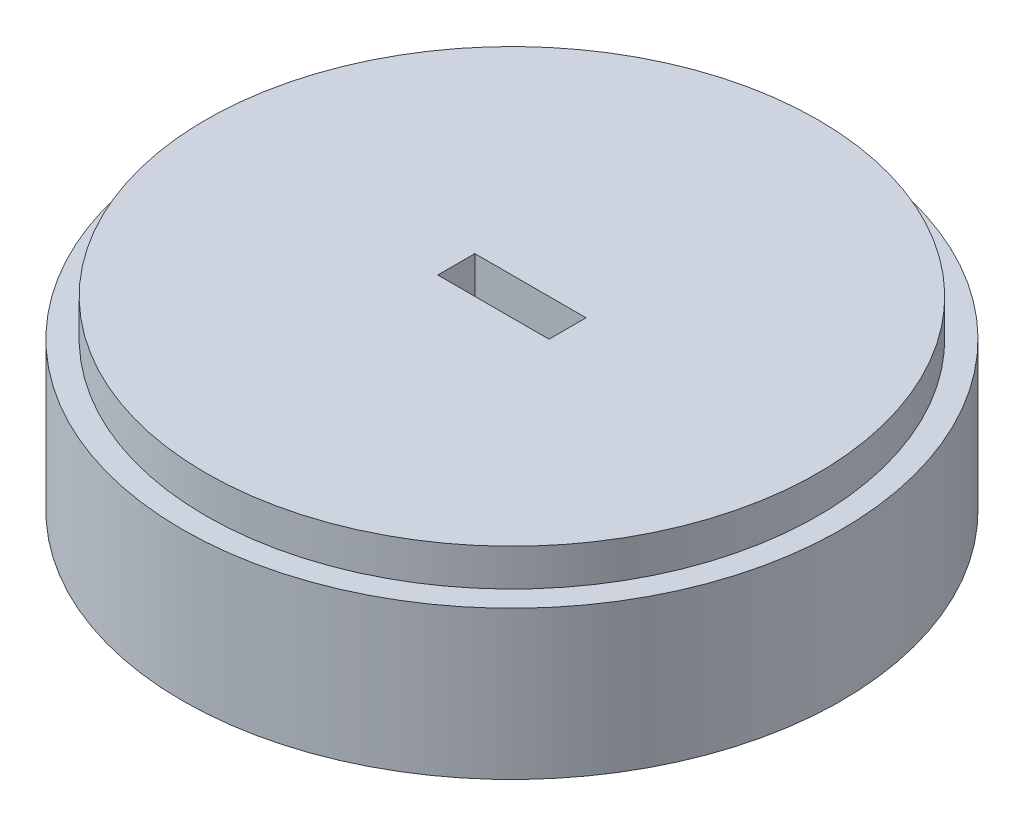
ISO-10303-21;
HEADER;
FILE_DESCRIPTION(('STEP AP214'),'2;1');
FILE_NAME('part.step','',(''),(''),'','','');
FILE_SCHEMA(('AUTOMOTIVE_DESIGN { 1 0 10303 214 1 1 1 1 }'));
ENDSEC;
DATA;
#1=APPLICATION_CONTEXT('core data for automotive mechanical design processes');
#2=APPLICATION_PROTOCOL_DEFINITION('international standard','automotive_design',2000,#1);
#3=PRODUCT_CONTEXT('',#1,'mechanical');
#4=PRODUCT('Part','Part','',(#3));
#5=PRODUCT_RELATED_PRODUCT_CATEGORY('part','',(#4));
#6=PRODUCT_DEFINITION_FORMATION('','',#4);
#7=PRODUCT_DEFINITION_CONTEXT('part definition',#1,'design');
#8=PRODUCT_DEFINITION('design','',#6,#7);
#9=PRODUCT_DEFINITION_SHAPE('','',#8);
#10=(LENGTH_UNIT() NAMED_UNIT(*) SI_UNIT(.MILLI.,.METRE.));
#11=(NAMED_UNIT(*) PLANE_ANGLE_UNIT() SI_UNIT($,.RADIAN.));
#12=(NAMED_UNIT(*) SI_UNIT($,.STERADIAN.) SOLID_ANGLE_UNIT());
#13=UNCERTAINTY_MEASURE_WITH_UNIT(LENGTH_MEASURE(1.E-05),#10,'distance_accuracy_value','');
#14=(GEOMETRIC_REPRESENTATION_CONTEXT(3) GLOBAL_UNCERTAINTY_ASSIGNED_CONTEXT((#13)) GLOBAL_UNIT_ASSIGNED_CONTEXT((#10,
#11,#12)) REPRESENTATION_CONTEXT('',''));
#15=CARTESIAN_POINT('',(0.,0.,0.));
#16=DIRECTION('',(0.,0.,1.));
#17=DIRECTION('',(1.,0.,0.));
#18=AXIS2_PLACEMENT_3D('',#15,#16,#17);
#19=CARTESIAN_POINT('',(0.,50.,0.));
#20=DIRECTION('',(0.,1.,0.));
#21=DIRECTION('',(0.,0.,1.));
#22=AXIS2_PLACEMENT_3D('',#19,#20,#21);
#23=PLANE('',#22);
#24=CARTESIAN_POINT('',(0.,50.,0.));
#25=DIRECTION('',(0.,1.,0.));
#26=DIRECTION('',(0.,0.,1.));
#27=AXIS2_PLACEMENT_3D('',#24,#25,#26);
#28=CIRCLE('',#27,82.55);
#29=CARTESIAN_POINT('',(0.,50.,82.55));
#30=VERTEX_POINT('',#29);
#31=EDGE_CURVE('E107',#30,#30,#28,.T.);
#32=ORIENTED_EDGE('',*,*,#31,.T.);
#33=EDGE_LOOP('',(#32));
#34=FACE_BOUND('',#33,.T.);
#35=DIRECTION('',(0.,0.,1.));
#36=VECTOR('',#35,1.);
#37=CARTESIAN_POINT('',(-15.,50.,-5.));
#38=LINE('',#37,#36);
#39=CARTESIAN_POINT('',(-15.,50.,-5.));
#40=VERTEX_POINT('',#39);
#41=CARTESIAN_POINT('',(-15.,50.,5.));
#42=VERTEX_POINT('',#41);
#43=EDGE_CURVE('E88',#40,#42,#38,.T.);
#44=ORIENTED_EDGE('',*,*,#43,.F.);
#45=DIRECTION('',(-1.,0.,0.));
#46=VECTOR('',#45,1.);
#47=CARTESIAN_POINT('',(-15.,50.,-5.));
#48=LINE('',#47,#46);
#49=CARTESIAN_POINT('',(15.,50.,-5.));
#50=VERTEX_POINT('',#49);
#51=EDGE_CURVE('E94',#50,#40,#48,.T.);
#52=ORIENTED_EDGE('',*,*,#51,.F.);
#53=DIRECTION('',(0.,0.,1.));
#54=VECTOR('',#53,1.);
#55=CARTESIAN_POINT('',(15.,50.,-5.));
#56=LINE('',#55,#54);
#57=CARTESIAN_POINT('',(15.,50.,5.));
#58=VERTEX_POINT('',#57);
#59=EDGE_CURVE('E79',#50,#58,#56,.T.);
#60=ORIENTED_EDGE('',*,*,#59,.T.);
#61=DIRECTION('',(-1.,0.,0.));
#62=VECTOR('',#61,1.);
#63=CARTESIAN_POINT('',(-15.,50.,5.));
#64=LINE('',#63,#62);
#65=EDGE_CURVE('E101',#58,#42,#64,.T.);
#66=ORIENTED_EDGE('',*,*,#65,.T.);
#67=EDGE_LOOP('',(#44,#52,#60,#66));
#68=FACE_BOUND('',#67,.T.);
#69=ADVANCED_FACE('F34',(#34,#68),#23,.T.);
#70=CARTESIAN_POINT('',(0.,40.,0.));
#71=DIRECTION('',(0.,-1.,0.));
#72=DIRECTION('',(0.,0.,-1.));
#73=AXIS2_PLACEMENT_3D('',#70,#71,#72);
#74=CYLINDRICAL_SURFACE('',#73,88.9);
#75=CARTESIAN_POINT('',(0.,40.,0.));
#76=DIRECTION('',(0.,1.,0.));
#77=DIRECTION('',(0.,0.,1.));
#78=AXIS2_PLACEMENT_3D('',#75,#76,#77);
#79=CIRCLE('',#78,88.9);
#80=CARTESIAN_POINT('',(0.,40.,88.9));
#81=VERTEX_POINT('',#80);
#82=EDGE_CURVE('E43',#81,#81,#79,.T.);
#83=ORIENTED_EDGE('',*,*,#82,.F.);
#84=EDGE_LOOP('',(#83));
#85=FACE_BOUND('',#84,.T.);
#86=CARTESIAN_POINT('',(0.,0.,0.));
#87=DIRECTION('',(0.,1.,0.));
#88=DIRECTION('',(0.,0.,1.));
#89=AXIS2_PLACEMENT_3D('',#86,#87,#88);
#90=CIRCLE('',#89,88.9);
#91=CARTESIAN_POINT('',(0.,0.,88.9));
#92=VERTEX_POINT('',#91);
#93=EDGE_CURVE('E38',#92,#92,#90,.T.);
#94=ORIENTED_EDGE('',*,*,#93,.T.);
#95=EDGE_LOOP('',(#94));
#96=FACE_BOUND('',#95,.T.);
#97=ADVANCED_FACE('F36',(#85,#96),#74,.T.);
#98=CARTESIAN_POINT('',(0.,40.,0.));
#99=DIRECTION('',(0.,1.,0.));
#100=DIRECTION('',(0.,0.,1.));
#101=AXIS2_PLACEMENT_3D('',#98,#99,#100);
#102=PLANE('',#101);
#103=CARTESIAN_POINT('',(0.,40.,0.));
#104=DIRECTION('',(0.,1.,0.));
#105=DIRECTION('',(0.,0.,1.));
#106=AXIS2_PLACEMENT_3D('',#103,#104,#105);
#107=CIRCLE('',#106,82.55);
#108=CARTESIAN_POINT('',(0.,40.,82.55));
#109=VERTEX_POINT('',#108);
#110=EDGE_CURVE('E11',#109,#109,#107,.T.);
#111=ORIENTED_EDGE('',*,*,#110,.F.);
#112=EDGE_LOOP('',(#111));
#113=FACE_BOUND('',#112,.T.);
#114=ORIENTED_EDGE('',*,*,#82,.T.);
#115=EDGE_LOOP('',(#114));
#116=FACE_BOUND('',#115,.T.);
#117=ADVANCED_FACE('F119',(#113,#116),#102,.T.);
#118=CARTESIAN_POINT('',(0.,0.,0.));
#119=DIRECTION('',(0.,1.,0.));
#120=DIRECTION('',(0.,0.,1.));
#121=AXIS2_PLACEMENT_3D('',#118,#119,#120);
#122=PLANE('',#121);
#123=ORIENTED_EDGE('',*,*,#93,.F.);
#124=EDGE_LOOP('',(#123));
#125=FACE_BOUND('',#124,.T.);
#126=ADVANCED_FACE('F116',(#125),#122,.F.);
#127=CARTESIAN_POINT('',(0.,50.,0.));
#128=DIRECTION('',(0.,-1.,0.));
#129=DIRECTION('',(0.,0.,-1.));
#130=AXIS2_PLACEMENT_3D('',#127,#128,#129);
#131=CYLINDRICAL_SURFACE('',#130,82.55);
#132=ORIENTED_EDGE('',*,*,#31,.F.);
#133=EDGE_LOOP('',(#132));
#134=FACE_BOUND('',#133,.T.);
#135=ORIENTED_EDGE('',*,*,#110,.T.);
#136=EDGE_LOOP('',(#135));
#137=FACE_BOUND('',#136,.T.);
#138=ADVANCED_FACE('F118',(#134,#137),#131,.T.);
#139=CARTESIAN_POINT('',(15.,50.,-5.));
#140=DIRECTION('',(1.,0.,0.));
#141=DIRECTION('',(0.,1.,0.));
#142=AXIS2_PLACEMENT_3D('',#139,#140,#141);
#143=PLANE('',#142);
#144=DIRECTION('',(0.,1.,0.));
#145=VECTOR('',#144,1.);
#146=CARTESIAN_POINT('',(15.,50.,5.));
#147=LINE('',#146,#145);
#148=CARTESIAN_POINT('',(15.,15.,5.));
#149=VERTEX_POINT('',#148);
#150=EDGE_CURVE('E204',#149,#58,#147,.T.);
#151=ORIENTED_EDGE('',*,*,#150,.T.);
#152=ORIENTED_EDGE('',*,*,#59,.F.);
#153=DIRECTION('',(0.,1.,0.));
#154=VECTOR('',#153,1.);
#155=CARTESIAN_POINT('',(15.,50.,-5.));
#156=LINE('',#155,#154);
#157=CARTESIAN_POINT('',(15.,15.,-5.));
#158=VERTEX_POINT('',#157);
#159=EDGE_CURVE('E98',#158,#50,#156,.T.);
#160=ORIENTED_EDGE('',*,*,#159,.F.);
#161=DIRECTION('',(0.,0.,1.));
#162=VECTOR('',#161,1.);
#163=CARTESIAN_POINT('',(15.,15.,-5.));
#164=LINE('',#163,#162);
#165=EDGE_CURVE('E60',#158,#149,#164,.T.);
#166=ORIENTED_EDGE('',*,*,#165,.T.);
#167=EDGE_LOOP('',(#151,#152,#160,#166));
#168=FACE_BOUND('',#167,.T.);
#169=ADVANCED_FACE('F124',(#168),#143,.F.);
#170=CARTESIAN_POINT('',(-15.,15.,-5.));
#171=DIRECTION('',(0.,-1.,0.));
#172=DIRECTION('',(0.,0.,-1.));
#173=AXIS2_PLACEMENT_3D('',#170,#171,#172);
#174=PLANE('',#173);
#175=DIRECTION('',(1.,0.,0.));
#176=VECTOR('',#175,1.);
#177=CARTESIAN_POINT('',(-15.,15.,5.));
#178=LINE('',#177,#176);
#179=CARTESIAN_POINT('',(-15.,15.,5.));
#180=VERTEX_POINT('',#179);
#181=EDGE_CURVE('E205',#180,#149,#178,.T.);
#182=ORIENTED_EDGE('',*,*,#181,.T.);
#183=ORIENTED_EDGE('',*,*,#165,.F.);
#184=DIRECTION('',(1.,0.,0.));
#185=VECTOR('',#184,1.);
#186=CARTESIAN_POINT('',(-15.,15.,-5.));
#187=LINE('',#186,#185);
#188=CARTESIAN_POINT('',(-15.,15.,-5.));
#189=VERTEX_POINT('',#188);
#190=EDGE_CURVE('E93',#189,#158,#187,.T.);
#191=ORIENTED_EDGE('',*,*,#190,.F.);
#192=DIRECTION('',(0.,0.,1.));
#193=VECTOR('',#192,1.);
#194=CARTESIAN_POINT('',(-15.,15.,-5.));
#195=LINE('',#194,#193);
#196=EDGE_CURVE('E90',#189,#180,#195,.T.);
#197=ORIENTED_EDGE('',*,*,#196,.T.);
#198=EDGE_LOOP('',(#182,#183,#191,#197));
#199=FACE_BOUND('',#198,.T.);
#200=ADVANCED_FACE('F139',(#199),#174,.F.);
#201=CARTESIAN_POINT('',(-15.,50.,-5.));
#202=DIRECTION('',(-1.,0.,0.));
#203=DIRECTION('',(0.,-1.,0.));
#204=AXIS2_PLACEMENT_3D('',#201,#202,#203);
#205=PLANE('',#204);
#206=DIRECTION('',(0.,-1.,0.));
#207=VECTOR('',#206,1.);
#208=CARTESIAN_POINT('',(-15.,50.,5.));
#209=LINE('',#208,#207);
#210=EDGE_CURVE('E51',#42,#180,#209,.T.);
#211=ORIENTED_EDGE('',*,*,#210,.T.);
#212=ORIENTED_EDGE('',*,*,#196,.F.);
#213=DIRECTION('',(0.,-1.,0.));
#214=VECTOR('',#213,1.);
#215=CARTESIAN_POINT('',(-15.,50.,-5.));
#216=LINE('',#215,#214);
#217=EDGE_CURVE('E84',#40,#189,#216,.T.);
#218=ORIENTED_EDGE('',*,*,#217,.F.);
#219=ORIENTED_EDGE('',*,*,#43,.T.);
#220=EDGE_LOOP('',(#211,#212,#218,#219));
#221=FACE_BOUND('',#220,.T.);
#222=ADVANCED_FACE('F86',(#221),#205,.F.);
#223=CARTESIAN_POINT('',(0.,0.,-5.));
#224=DIRECTION('',(0.,0.,1.));
#225=DIRECTION('',(1.,0.,0.));
#226=AXIS2_PLACEMENT_3D('',#223,#224,#225);
#227=PLANE('',#226);
#228=ORIENTED_EDGE('',*,*,#159,.T.);
#229=ORIENTED_EDGE('',*,*,#51,.T.);
#230=ORIENTED_EDGE('',*,*,#217,.T.);
#231=ORIENTED_EDGE('',*,*,#190,.T.);
#232=EDGE_LOOP('',(#228,#229,#230,#231));
#233=FACE_BOUND('',#232,.T.);
#234=ADVANCED_FACE('F97',(#233),#227,.T.);
#235=CARTESIAN_POINT('',(0.,0.,5.));
#236=DIRECTION('',(0.,0.,1.));
#237=DIRECTION('',(1.,0.,0.));
#238=AXIS2_PLACEMENT_3D('',#235,#236,#237);
#239=PLANE('',#238);
#240=ORIENTED_EDGE('',*,*,#150,.F.);
#241=ORIENTED_EDGE('',*,*,#181,.F.);
#242=ORIENTED_EDGE('',*,*,#210,.F.);
#243=ORIENTED_EDGE('',*,*,#65,.F.);
#244=EDGE_LOOP('',(#240,#241,#242,#243));
#245=FACE_BOUND('',#244,.T.);
#246=ADVANCED_FACE('F144',(#245),#239,.F.);
#247=CLOSED_SHELL('',(#69,#97,#117,#126,#138,#169,#200,#222,#234,#246));
#248=MANIFOLD_SOLID_BREP('B2',#247);
#249=ADVANCED_BREP_SHAPE_REPRESENTATION('',(#18,#248),#14);
#250=SHAPE_DEFINITION_REPRESENTATION(#9,#249);
ENDSEC;
END-ISO-10303-21;
